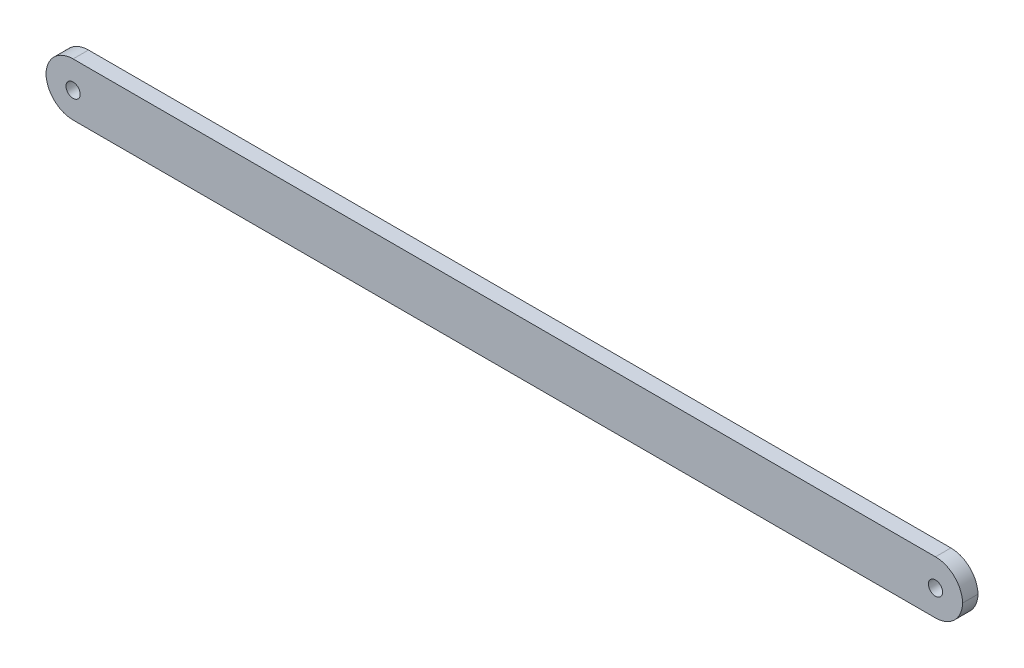
ISO-10303-21;
HEADER;
FILE_DESCRIPTION(('STEP AP214'),'2;1');
FILE_NAME('part.step','',(''),(''),'','','');
FILE_SCHEMA(('AUTOMOTIVE_DESIGN { 1 0 10303 214 1 1 1 1 }'));
ENDSEC;
DATA;
#1=APPLICATION_CONTEXT('core data for automotive mechanical design processes');
#2=APPLICATION_PROTOCOL_DEFINITION('international standard','automotive_design',2000,#1);
#3=PRODUCT_CONTEXT('',#1,'mechanical');
#4=PRODUCT('Part','Part','',(#3));
#5=PRODUCT_RELATED_PRODUCT_CATEGORY('part','',(#4));
#6=PRODUCT_DEFINITION_FORMATION('','',#4);
#7=PRODUCT_DEFINITION_CONTEXT('part definition',#1,'design');
#8=PRODUCT_DEFINITION('design','',#6,#7);
#9=PRODUCT_DEFINITION_SHAPE('','',#8);
#10=(LENGTH_UNIT() NAMED_UNIT(*) SI_UNIT(.MILLI.,.METRE.));
#11=(NAMED_UNIT(*) PLANE_ANGLE_UNIT() SI_UNIT($,.RADIAN.));
#12=(NAMED_UNIT(*) SI_UNIT($,.STERADIAN.) SOLID_ANGLE_UNIT());
#13=UNCERTAINTY_MEASURE_WITH_UNIT(LENGTH_MEASURE(1.E-05),#10,'distance_accuracy_value','');
#14=(GEOMETRIC_REPRESENTATION_CONTEXT(3) GLOBAL_UNCERTAINTY_ASSIGNED_CONTEXT((#13)) GLOBAL_UNIT_ASSIGNED_CONTEXT((#10,
#11,#12)) REPRESENTATION_CONTEXT('',''));
#15=CARTESIAN_POINT('',(0.,0.,0.));
#16=DIRECTION('',(0.,0.,1.));
#17=DIRECTION('',(1.,0.,0.));
#18=AXIS2_PLACEMENT_3D('',#15,#16,#17);
#19=CARTESIAN_POINT('',(-94.488,5.461,3.175));
#20=DIRECTION('',(0.,-1.,0.));
#21=DIRECTION('',(0.,0.,-1.));
#22=AXIS2_PLACEMENT_3D('',#19,#20,#21);
#23=PLANE('',#22);
#24=DIRECTION('',(-1.,0.,0.));
#25=VECTOR('',#24,1.);
#26=CARTESIAN_POINT('',(-94.488,5.461,0.));
#27=LINE('',#26,#25);
#28=CARTESIAN_POINT('',(88.9,5.461,0.));
#29=VERTEX_POINT('',#28);
#30=CARTESIAN_POINT('',(-88.9,5.461,0.));
#31=VERTEX_POINT('',#30);
#32=EDGE_CURVE('E117',#29,#31,#27,.T.);
#33=ORIENTED_EDGE('',*,*,#32,.T.);
#34=DIRECTION('',(0.,0.,-1.));
#35=VECTOR('',#34,1.);
#36=CARTESIAN_POINT('',(-88.9,5.461,3.175));
#37=LINE('',#36,#35);
#38=CARTESIAN_POINT('',(-88.9,5.461,3.175));
#39=VERTEX_POINT('',#38);
#40=EDGE_CURVE('E11',#31,#39,#37,.F.);
#41=ORIENTED_EDGE('',*,*,#40,.T.);
#42=DIRECTION('',(-1.,0.,0.));
#43=VECTOR('',#42,1.);
#44=CARTESIAN_POINT('',(-94.488,5.461,3.175));
#45=LINE('',#44,#43);
#46=CARTESIAN_POINT('',(88.9,5.461,3.175));
#47=VERTEX_POINT('',#46);
#48=EDGE_CURVE('E118',#47,#39,#45,.T.);
#49=ORIENTED_EDGE('',*,*,#48,.F.);
#50=DIRECTION('',(0.,0.,-1.));
#51=VECTOR('',#50,1.);
#52=CARTESIAN_POINT('',(88.9,5.461,3.175));
#53=LINE('',#52,#51);
#54=EDGE_CURVE('E48',#47,#29,#53,.T.);
#55=ORIENTED_EDGE('',*,*,#54,.T.);
#56=EDGE_LOOP('',(#33,#41,#49,#55));
#57=FACE_BOUND('',#56,.T.);
#58=ADVANCED_FACE('F39',(#57),#23,.F.);
#59=CARTESIAN_POINT('',(-94.488,-5.461,3.175));
#60=DIRECTION('',(0.,1.,0.));
#61=DIRECTION('',(0.,0.,1.));
#62=AXIS2_PLACEMENT_3D('',#59,#60,#61);
#63=PLANE('',#62);
#64=DIRECTION('',(1.,0.,0.));
#65=VECTOR('',#64,1.);
#66=CARTESIAN_POINT('',(-94.488,-5.461,3.175));
#67=LINE('',#66,#65);
#68=CARTESIAN_POINT('',(-88.9,-5.461,3.175));
#69=VERTEX_POINT('',#68);
#70=CARTESIAN_POINT('',(88.9,-5.461,3.175));
#71=VERTEX_POINT('',#70);
#72=EDGE_CURVE('E115',#69,#71,#67,.T.);
#73=ORIENTED_EDGE('',*,*,#72,.F.);
#74=DIRECTION('',(0.,0.,-1.));
#75=VECTOR('',#74,1.);
#76=CARTESIAN_POINT('',(-88.9,-5.461,3.175));
#77=LINE('',#76,#75);
#78=CARTESIAN_POINT('',(-88.9,-5.461,0.));
#79=VERTEX_POINT('',#78);
#80=EDGE_CURVE('E100',#69,#79,#77,.T.);
#81=ORIENTED_EDGE('',*,*,#80,.T.);
#82=DIRECTION('',(1.,0.,0.));
#83=VECTOR('',#82,1.);
#84=CARTESIAN_POINT('',(-94.488,-5.461,0.));
#85=LINE('',#84,#83);
#86=CARTESIAN_POINT('',(88.9,-5.461,0.));
#87=VERTEX_POINT('',#86);
#88=EDGE_CURVE('E109',#79,#87,#85,.T.);
#89=ORIENTED_EDGE('',*,*,#88,.T.);
#90=DIRECTION('',(0.,0.,-1.));
#91=VECTOR('',#90,1.);
#92=CARTESIAN_POINT('',(88.9,-5.461,3.175));
#93=LINE('',#92,#91);
#94=EDGE_CURVE('E111',#87,#71,#93,.F.);
#95=ORIENTED_EDGE('',*,*,#94,.T.);
#96=EDGE_LOOP('',(#73,#81,#89,#95));
#97=FACE_BOUND('',#96,.T.);
#98=ADVANCED_FACE('F107',(#97),#63,.F.);
#99=CARTESIAN_POINT('',(0.,0.,3.175));
#100=DIRECTION('',(0.,0.,-1.));
#101=DIRECTION('',(-1.,0.,0.));
#102=AXIS2_PLACEMENT_3D('',#99,#100,#101);
#103=PLANE('',#102);
#104=CARTESIAN_POINT('',(-88.9,-0.127,3.175));
#105=DIRECTION('',(0.,0.,1.));
#106=DIRECTION('',(1.,0.,0.));
#107=AXIS2_PLACEMENT_3D('',#104,#105,#106);
#108=CIRCLE('',#107,1.4605);
#109=CARTESIAN_POINT('',(-87.4395,-0.127,3.175));
#110=VERTEX_POINT('',#109);
#111=EDGE_CURVE('E143',#110,#110,#108,.T.);
#112=ORIENTED_EDGE('',*,*,#111,.F.);
#113=EDGE_LOOP('',(#112));
#114=FACE_BOUND('',#113,.T.);
#115=CARTESIAN_POINT('',(88.9,-0.127,3.175));
#116=DIRECTION('',(0.,0.,1.));
#117=DIRECTION('',(1.,0.,0.));
#118=AXIS2_PLACEMENT_3D('',#115,#116,#117);
#119=CIRCLE('',#118,1.4605);
#120=CARTESIAN_POINT('',(90.3605,-0.127,3.175));
#121=VERTEX_POINT('',#120);
#122=EDGE_CURVE('E148',#121,#121,#119,.T.);
#123=ORIENTED_EDGE('',*,*,#122,.F.);
#124=EDGE_LOOP('',(#123));
#125=FACE_BOUND('',#124,.T.);
#126=CARTESIAN_POINT('',(-88.9,-0.127,3.175));
#127=DIRECTION('',(0.,0.,-1.));
#128=DIRECTION('',(-1.,0.,0.));
#129=AXIS2_PLACEMENT_3D('',#126,#127,#128);
#130=CIRCLE('',#129,5.588);
#131=CARTESIAN_POINT('',(-94.4865566317724,0.,3.175));
#132=VERTEX_POINT('',#131);
#133=EDGE_CURVE('E57',#39,#132,#130,.F.);
#134=ORIENTED_EDGE('',*,*,#133,.T.);
#135=CARTESIAN_POINT('',(-88.9,0.127000000000001,3.175));
#136=DIRECTION('',(0.,0.,-1.));
#137=DIRECTION('',(-1.,0.,0.));
#138=AXIS2_PLACEMENT_3D('',#135,#136,#137);
#139=CIRCLE('',#138,5.588);
#140=EDGE_CURVE('E133',#132,#69,#139,.F.);
#141=ORIENTED_EDGE('',*,*,#140,.T.);
#142=ORIENTED_EDGE('',*,*,#72,.T.);
#143=CARTESIAN_POINT('',(88.9,0.127000000000001,3.175));
#144=DIRECTION('',(0.,0.,-1.));
#145=DIRECTION('',(-1.,0.,0.));
#146=AXIS2_PLACEMENT_3D('',#143,#144,#145);
#147=CIRCLE('',#146,5.588);
#148=CARTESIAN_POINT('',(94.4865566317724,-3.04660810468427E-13,3.175));
#149=VERTEX_POINT('',#148);
#150=EDGE_CURVE('E65',#71,#149,#147,.F.);
#151=ORIENTED_EDGE('',*,*,#150,.T.);
#152=CARTESIAN_POINT('',(88.9,-0.127,3.175));
#153=DIRECTION('',(0.,0.,-1.));
#154=DIRECTION('',(-1.,0.,0.));
#155=AXIS2_PLACEMENT_3D('',#152,#153,#154);
#156=CIRCLE('',#155,5.588);
#157=EDGE_CURVE('E105',#149,#47,#156,.F.);
#158=ORIENTED_EDGE('',*,*,#157,.T.);
#159=ORIENTED_EDGE('',*,*,#48,.T.);
#160=EDGE_LOOP('',(#134,#141,#142,#151,#158,#159));
#161=FACE_BOUND('',#160,.T.);
#162=ADVANCED_FACE('F153',(#114,#125,#161),#103,.F.);
#163=CARTESIAN_POINT('',(0.,0.,0.));
#164=DIRECTION('',(0.,0.,-1.));
#165=DIRECTION('',(-1.,0.,0.));
#166=AXIS2_PLACEMENT_3D('',#163,#164,#165);
#167=PLANE('',#166);
#168=CARTESIAN_POINT('',(-88.9,-0.127,0.));
#169=DIRECTION('',(0.,0.,1.));
#170=DIRECTION('',(1.,0.,0.));
#171=AXIS2_PLACEMENT_3D('',#168,#169,#170);
#172=CIRCLE('',#171,1.4605);
#173=CARTESIAN_POINT('',(-87.4395,-0.127,0.));
#174=VERTEX_POINT('',#173);
#175=EDGE_CURVE('E139',#174,#174,#172,.T.);
#176=ORIENTED_EDGE('',*,*,#175,.T.);
#177=EDGE_LOOP('',(#176));
#178=FACE_BOUND('',#177,.T.);
#179=CARTESIAN_POINT('',(88.9,-0.127,0.));
#180=DIRECTION('',(0.,0.,1.));
#181=DIRECTION('',(1.,0.,0.));
#182=AXIS2_PLACEMENT_3D('',#179,#180,#181);
#183=CIRCLE('',#182,1.4605);
#184=CARTESIAN_POINT('',(90.3605,-0.127,0.));
#185=VERTEX_POINT('',#184);
#186=EDGE_CURVE('E151',#185,#185,#183,.T.);
#187=ORIENTED_EDGE('',*,*,#186,.T.);
#188=EDGE_LOOP('',(#187));
#189=FACE_BOUND('',#188,.T.);
#190=ORIENTED_EDGE('',*,*,#88,.F.);
#191=CARTESIAN_POINT('',(-88.9,0.127000000000001,0.));
#192=DIRECTION('',(0.,0.,-1.));
#193=DIRECTION('',(-1.,0.,0.));
#194=AXIS2_PLACEMENT_3D('',#191,#192,#193);
#195=CIRCLE('',#194,5.588);
#196=CARTESIAN_POINT('',(-94.4865566317724,0.,0.));
#197=VERTEX_POINT('',#196);
#198=EDGE_CURVE('E91',#79,#197,#195,.T.);
#199=ORIENTED_EDGE('',*,*,#198,.T.);
#200=CARTESIAN_POINT('',(-88.9,-0.127,0.));
#201=DIRECTION('',(0.,0.,-1.));
#202=DIRECTION('',(-1.,0.,0.));
#203=AXIS2_PLACEMENT_3D('',#200,#201,#202);
#204=CIRCLE('',#203,5.588);
#205=EDGE_CURVE('E103',#197,#31,#204,.T.);
#206=ORIENTED_EDGE('',*,*,#205,.T.);
#207=ORIENTED_EDGE('',*,*,#32,.F.);
#208=CARTESIAN_POINT('',(88.9,-0.127,0.));
#209=DIRECTION('',(0.,0.,-1.));
#210=DIRECTION('',(-1.,0.,0.));
#211=AXIS2_PLACEMENT_3D('',#208,#209,#210);
#212=CIRCLE('',#211,5.588);
#213=CARTESIAN_POINT('',(94.4865566317724,-3.04660810468427E-13,0.));
#214=VERTEX_POINT('',#213);
#215=EDGE_CURVE('E114',#29,#214,#212,.T.);
#216=ORIENTED_EDGE('',*,*,#215,.T.);
#217=CARTESIAN_POINT('',(88.9,0.127000000000001,0.));
#218=DIRECTION('',(0.,0.,-1.));
#219=DIRECTION('',(-1.,0.,0.));
#220=AXIS2_PLACEMENT_3D('',#217,#218,#219);
#221=CIRCLE('',#220,5.588);
#222=EDGE_CURVE('E120',#214,#87,#221,.T.);
#223=ORIENTED_EDGE('',*,*,#222,.T.);
#224=EDGE_LOOP('',(#190,#199,#206,#207,#216,#223));
#225=FACE_BOUND('',#224,.T.);
#226=ADVANCED_FACE('F119',(#178,#189,#225),#167,.T.);
#227=CARTESIAN_POINT('',(-88.9,-0.127,3.175));
#228=DIRECTION('',(0.,0.,-1.));
#229=DIRECTION('',(-1.,0.,0.));
#230=AXIS2_PLACEMENT_3D('',#227,#228,#229);
#231=CYLINDRICAL_SURFACE('',#230,5.588);
#232=DIRECTION('',(0.,0.,-1.));
#233=VECTOR('',#232,1.);
#234=CARTESIAN_POINT('',(-94.4865566317724,0.,1.5875));
#235=LINE('',#234,#233);
#236=EDGE_CURVE('E98',#132,#197,#235,.T.);
#237=ORIENTED_EDGE('',*,*,#236,.F.);
#238=ORIENTED_EDGE('',*,*,#133,.F.);
#239=ORIENTED_EDGE('',*,*,#40,.F.);
#240=ORIENTED_EDGE('',*,*,#205,.F.);
#241=EDGE_LOOP('',(#237,#238,#239,#240));
#242=FACE_BOUND('',#241,.T.);
#243=ADVANCED_FACE('F161',(#242),#231,.T.);
#244=CARTESIAN_POINT('',(-88.9,0.127000000000001,3.175));
#245=DIRECTION('',(0.,0.,-1.));
#246=DIRECTION('',(-1.,0.,0.));
#247=AXIS2_PLACEMENT_3D('',#244,#245,#246);
#248=CYLINDRICAL_SURFACE('',#247,5.588);
#249=ORIENTED_EDGE('',*,*,#140,.F.);
#250=ORIENTED_EDGE('',*,*,#236,.T.);
#251=ORIENTED_EDGE('',*,*,#198,.F.);
#252=ORIENTED_EDGE('',*,*,#80,.F.);
#253=EDGE_LOOP('',(#249,#250,#251,#252));
#254=FACE_BOUND('',#253,.T.);
#255=ADVANCED_FACE('F96',(#254),#248,.T.);
#256=CARTESIAN_POINT('',(88.9,-0.127,3.175));
#257=DIRECTION('',(0.,0.,-1.));
#258=DIRECTION('',(-1.,0.,0.));
#259=AXIS2_PLACEMENT_3D('',#256,#257,#258);
#260=CYLINDRICAL_SURFACE('',#259,5.588);
#261=ORIENTED_EDGE('',*,*,#54,.F.);
#262=ORIENTED_EDGE('',*,*,#157,.F.);
#263=DIRECTION('',(0.,0.,-1.));
#264=VECTOR('',#263,1.);
#265=CARTESIAN_POINT('',(94.4865566317724,-3.04660810468427E-13,1.5875));
#266=LINE('',#265,#264);
#267=EDGE_CURVE('E43',#214,#149,#266,.F.);
#268=ORIENTED_EDGE('',*,*,#267,.F.);
#269=ORIENTED_EDGE('',*,*,#215,.F.);
#270=EDGE_LOOP('',(#261,#262,#268,#269));
#271=FACE_BOUND('',#270,.T.);
#272=ADVANCED_FACE('F41',(#271),#260,.T.);
#273=CARTESIAN_POINT('',(88.9,0.127000000000001,3.175));
#274=DIRECTION('',(0.,0.,-1.));
#275=DIRECTION('',(-1.,0.,0.));
#276=AXIS2_PLACEMENT_3D('',#273,#274,#275);
#277=CYLINDRICAL_SURFACE('',#276,5.588);
#278=ORIENTED_EDGE('',*,*,#150,.F.);
#279=ORIENTED_EDGE('',*,*,#94,.F.);
#280=ORIENTED_EDGE('',*,*,#222,.F.);
#281=ORIENTED_EDGE('',*,*,#267,.T.);
#282=EDGE_LOOP('',(#278,#279,#280,#281));
#283=FACE_BOUND('',#282,.T.);
#284=ADVANCED_FACE('F177',(#283),#277,.T.);
#285=CARTESIAN_POINT('',(88.9,-0.127,0.));
#286=DIRECTION('',(0.,0.,1.));
#287=DIRECTION('',(1.,0.,0.));
#288=AXIS2_PLACEMENT_3D('',#285,#286,#287);
#289=CYLINDRICAL_SURFACE('',#288,1.4605);
#290=ORIENTED_EDGE('',*,*,#186,.F.);
#291=EDGE_LOOP('',(#290));
#292=FACE_BOUND('',#291,.T.);
#293=ORIENTED_EDGE('',*,*,#122,.T.);
#294=EDGE_LOOP('',(#293));
#295=FACE_BOUND('',#294,.T.);
#296=ADVANCED_FACE('F180',(#292,#295),#289,.F.);
#297=CARTESIAN_POINT('',(-88.9,-0.127,0.));
#298=DIRECTION('',(0.,0.,1.));
#299=DIRECTION('',(1.,0.,0.));
#300=AXIS2_PLACEMENT_3D('',#297,#298,#299);
#301=CYLINDRICAL_SURFACE('',#300,1.4605);
#302=ORIENTED_EDGE('',*,*,#175,.F.);
#303=EDGE_LOOP('',(#302));
#304=FACE_BOUND('',#303,.T.);
#305=ORIENTED_EDGE('',*,*,#111,.T.);
#306=EDGE_LOOP('',(#305));
#307=FACE_BOUND('',#306,.T.);
#308=ADVANCED_FACE('F184',(#304,#307),#301,.F.);
#309=CLOSED_SHELL('',(#58,#98,#162,#226,#243,#255,#272,#284,#296,#308));
#310=MANIFOLD_SOLID_BREP('B2',#309);
#311=ADVANCED_BREP_SHAPE_REPRESENTATION('',(#18,#310),#14);
#312=SHAPE_DEFINITION_REPRESENTATION(#9,#311);
ENDSEC;
END-ISO-10303-21;
